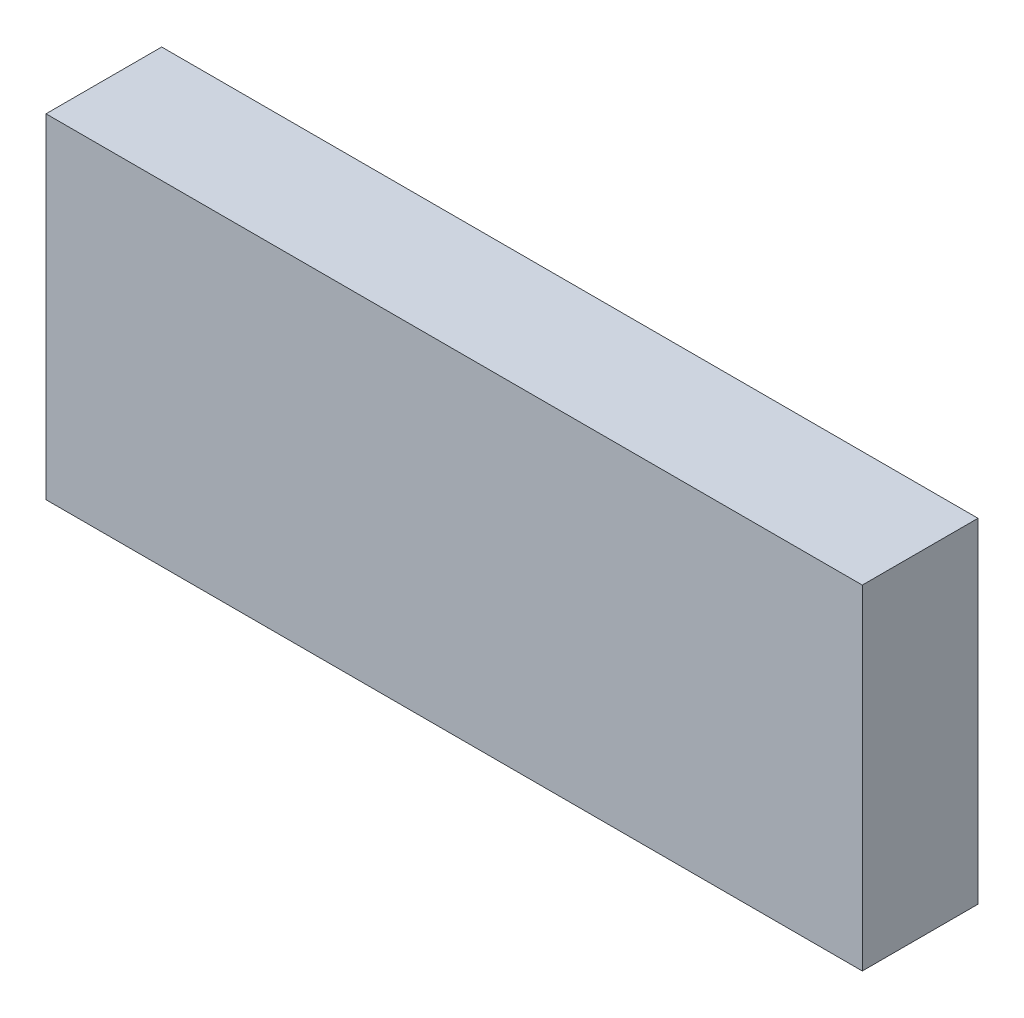
ISO-10303-21;
HEADER;
FILE_DESCRIPTION(('STEP AP214'),'2;1');
FILE_NAME('part.step','',(''),(''),'','','');
FILE_SCHEMA(('AUTOMOTIVE_DESIGN { 1 0 10303 214 1 1 1 1 }'));
ENDSEC;
DATA;
#1=APPLICATION_CONTEXT('core data for automotive mechanical design processes');
#2=APPLICATION_PROTOCOL_DEFINITION('international standard','automotive_design',2000,#1);
#3=PRODUCT_CONTEXT('',#1,'mechanical');
#4=PRODUCT('Part','Part','',(#3));
#5=PRODUCT_RELATED_PRODUCT_CATEGORY('part','',(#4));
#6=PRODUCT_DEFINITION_FORMATION('','',#4);
#7=PRODUCT_DEFINITION_CONTEXT('part definition',#1,'design');
#8=PRODUCT_DEFINITION('design','',#6,#7);
#9=PRODUCT_DEFINITION_SHAPE('','',#8);
#10=(LENGTH_UNIT() NAMED_UNIT(*) SI_UNIT(.MILLI.,.METRE.));
#11=(NAMED_UNIT(*) PLANE_ANGLE_UNIT() SI_UNIT($,.RADIAN.));
#12=(NAMED_UNIT(*) SI_UNIT($,.STERADIAN.) SOLID_ANGLE_UNIT());
#13=UNCERTAINTY_MEASURE_WITH_UNIT(LENGTH_MEASURE(1.E-05),#10,'distance_accuracy_value','');
#14=(GEOMETRIC_REPRESENTATION_CONTEXT(3) GLOBAL_UNCERTAINTY_ASSIGNED_CONTEXT((#13)) GLOBAL_UNIT_ASSIGNED_CONTEXT((#10,
#11,#12)) REPRESENTATION_CONTEXT('',''));
#15=CARTESIAN_POINT('',(0.,0.,0.));
#16=DIRECTION('',(0.,0.,1.));
#17=DIRECTION('',(1.,0.,0.));
#18=AXIS2_PLACEMENT_3D('',#15,#16,#17);
#19=CARTESIAN_POINT('',(31.75,-13.,9.));
#20=DIRECTION('',(-1.,0.,0.));
#21=DIRECTION('',(0.,0.,1.));
#22=AXIS2_PLACEMENT_3D('',#19,#20,#21);
#23=PLANE('',#22);
#24=DIRECTION('',(0.,1.,0.));
#25=VECTOR('',#24,1.);
#26=CARTESIAN_POINT('',(31.75,-13.,0.));
#27=LINE('',#26,#25);
#28=CARTESIAN_POINT('',(31.75,-13.,0.));
#29=VERTEX_POINT('',#28);
#30=CARTESIAN_POINT('',(31.75,13.,0.));
#31=VERTEX_POINT('',#30);
#32=EDGE_CURVE('E113',#29,#31,#27,.T.);
#33=ORIENTED_EDGE('',*,*,#32,.T.);
#34=DIRECTION('',(0.,0.,-1.));
#35=VECTOR('',#34,1.);
#36=CARTESIAN_POINT('',(31.75,13.,9.));
#37=LINE('',#36,#35);
#38=CARTESIAN_POINT('',(31.75,13.,9.));
#39=VERTEX_POINT('',#38);
#40=EDGE_CURVE('E11',#39,#31,#37,.T.);
#41=ORIENTED_EDGE('',*,*,#40,.F.);
#42=DIRECTION('',(0.,1.,0.));
#43=VECTOR('',#42,1.);
#44=CARTESIAN_POINT('',(31.75,-13.,9.));
#45=LINE('',#44,#43);
#46=CARTESIAN_POINT('',(31.75,-13.,9.));
#47=VERTEX_POINT('',#46);
#48=EDGE_CURVE('E97',#47,#39,#45,.T.);
#49=ORIENTED_EDGE('',*,*,#48,.F.);
#50=DIRECTION('',(0.,0.,-1.));
#51=VECTOR('',#50,1.);
#52=CARTESIAN_POINT('',(31.75,-13.,9.));
#53=LINE('',#52,#51);
#54=EDGE_CURVE('E109',#47,#29,#53,.T.);
#55=ORIENTED_EDGE('',*,*,#54,.T.);
#56=EDGE_LOOP('',(#33,#41,#49,#55));
#57=FACE_BOUND('',#56,.T.);
#58=ADVANCED_FACE('F45',(#57),#23,.F.);
#59=CARTESIAN_POINT('',(-31.75,13.,9.));
#60=DIRECTION('',(0.,-1.,0.));
#61=DIRECTION('',(0.,0.,-1.));
#62=AXIS2_PLACEMENT_3D('',#59,#60,#61);
#63=PLANE('',#62);
#64=DIRECTION('',(-1.,0.,0.));
#65=VECTOR('',#64,1.);
#66=CARTESIAN_POINT('',(-31.75,13.,0.));
#67=LINE('',#66,#65);
#68=CARTESIAN_POINT('',(-31.75,13.,0.));
#69=VERTEX_POINT('',#68);
#70=EDGE_CURVE('E102',#31,#69,#67,.T.);
#71=ORIENTED_EDGE('',*,*,#70,.T.);
#72=DIRECTION('',(0.,0.,-1.));
#73=VECTOR('',#72,1.);
#74=CARTESIAN_POINT('',(-31.75,13.,9.));
#75=LINE('',#74,#73);
#76=CARTESIAN_POINT('',(-31.75,13.,9.));
#77=VERTEX_POINT('',#76);
#78=EDGE_CURVE('E54',#77,#69,#75,.T.);
#79=ORIENTED_EDGE('',*,*,#78,.F.);
#80=DIRECTION('',(-1.,0.,0.));
#81=VECTOR('',#80,1.);
#82=CARTESIAN_POINT('',(-31.75,13.,9.));
#83=LINE('',#82,#81);
#84=EDGE_CURVE('E92',#39,#77,#83,.T.);
#85=ORIENTED_EDGE('',*,*,#84,.F.);
#86=ORIENTED_EDGE('',*,*,#40,.T.);
#87=EDGE_LOOP('',(#71,#79,#85,#86));
#88=FACE_BOUND('',#87,.T.);
#89=ADVANCED_FACE('F101',(#88),#63,.F.);
#90=CARTESIAN_POINT('',(-31.75,-13.,9.));
#91=DIRECTION('',(1.,0.,0.));
#92=DIRECTION('',(0.,0.,-1.));
#93=AXIS2_PLACEMENT_3D('',#90,#91,#92);
#94=PLANE('',#93);
#95=DIRECTION('',(0.,-1.,0.));
#96=VECTOR('',#95,1.);
#97=CARTESIAN_POINT('',(-31.75,-13.,0.));
#98=LINE('',#97,#96);
#99=CARTESIAN_POINT('',(-31.75,-13.,0.));
#100=VERTEX_POINT('',#99);
#101=EDGE_CURVE('E79',#69,#100,#98,.T.);
#102=ORIENTED_EDGE('',*,*,#101,.T.);
#103=DIRECTION('',(0.,0.,-1.));
#104=VECTOR('',#103,1.);
#105=CARTESIAN_POINT('',(-31.75,-13.,9.));
#106=LINE('',#105,#104);
#107=CARTESIAN_POINT('',(-31.75,-13.,9.));
#108=VERTEX_POINT('',#107);
#109=EDGE_CURVE('E104',#108,#100,#106,.T.);
#110=ORIENTED_EDGE('',*,*,#109,.F.);
#111=DIRECTION('',(0.,-1.,0.));
#112=VECTOR('',#111,1.);
#113=CARTESIAN_POINT('',(-31.75,-13.,9.));
#114=LINE('',#113,#112);
#115=EDGE_CURVE('E95',#77,#108,#114,.T.);
#116=ORIENTED_EDGE('',*,*,#115,.F.);
#117=ORIENTED_EDGE('',*,*,#78,.T.);
#118=EDGE_LOOP('',(#102,#110,#116,#117));
#119=FACE_BOUND('',#118,.T.);
#120=ADVANCED_FACE('F105',(#119),#94,.F.);
#121=CARTESIAN_POINT('',(-31.75,-13.,9.));
#122=DIRECTION('',(0.,1.,0.));
#123=DIRECTION('',(0.,0.,1.));
#124=AXIS2_PLACEMENT_3D('',#121,#122,#123);
#125=PLANE('',#124);
#126=DIRECTION('',(1.,0.,0.));
#127=VECTOR('',#126,1.);
#128=CARTESIAN_POINT('',(-31.75,-13.,0.));
#129=LINE('',#128,#127);
#130=EDGE_CURVE('E85',#100,#29,#129,.T.);
#131=ORIENTED_EDGE('',*,*,#130,.T.);
#132=ORIENTED_EDGE('',*,*,#54,.F.);
#133=DIRECTION('',(1.,0.,0.));
#134=VECTOR('',#133,1.);
#135=CARTESIAN_POINT('',(-31.75,-13.,9.));
#136=LINE('',#135,#134);
#137=EDGE_CURVE('E62',#108,#47,#136,.T.);
#138=ORIENTED_EDGE('',*,*,#137,.F.);
#139=ORIENTED_EDGE('',*,*,#109,.T.);
#140=EDGE_LOOP('',(#131,#132,#138,#139));
#141=FACE_BOUND('',#140,.T.);
#142=ADVANCED_FACE('F126',(#141),#125,.F.);
#143=CARTESIAN_POINT('',(0.,0.,9.));
#144=DIRECTION('',(0.,0.,-1.));
#145=DIRECTION('',(-1.,0.,0.));
#146=AXIS2_PLACEMENT_3D('',#143,#144,#145);
#147=PLANE('',#146);
#148=ORIENTED_EDGE('',*,*,#48,.T.);
#149=ORIENTED_EDGE('',*,*,#84,.T.);
#150=ORIENTED_EDGE('',*,*,#115,.T.);
#151=ORIENTED_EDGE('',*,*,#137,.T.);
#152=EDGE_LOOP('',(#148,#149,#150,#151));
#153=FACE_BOUND('',#152,.T.);
#154=ADVANCED_FACE('F93',(#153),#147,.F.);
#155=CARTESIAN_POINT('',(0.,0.,0.));
#156=DIRECTION('',(0.,0.,-1.));
#157=DIRECTION('',(-1.,0.,0.));
#158=AXIS2_PLACEMENT_3D('',#155,#156,#157);
#159=PLANE('',#158);
#160=ORIENTED_EDGE('',*,*,#32,.F.);
#161=ORIENTED_EDGE('',*,*,#130,.F.);
#162=ORIENTED_EDGE('',*,*,#101,.F.);
#163=ORIENTED_EDGE('',*,*,#70,.F.);
#164=EDGE_LOOP('',(#160,#161,#162,#163));
#165=FACE_BOUND('',#164,.T.);
#166=ADVANCED_FACE('F129',(#165),#159,.T.);
#167=CLOSED_SHELL('',(#58,#89,#120,#142,#154,#166));
#168=MANIFOLD_SOLID_BREP('B2',#167);
#169=ADVANCED_BREP_SHAPE_REPRESENTATION('',(#18,#168),#14);
#170=SHAPE_DEFINITION_REPRESENTATION(#9,#169);
ENDSEC;
END-ISO-10303-21;
